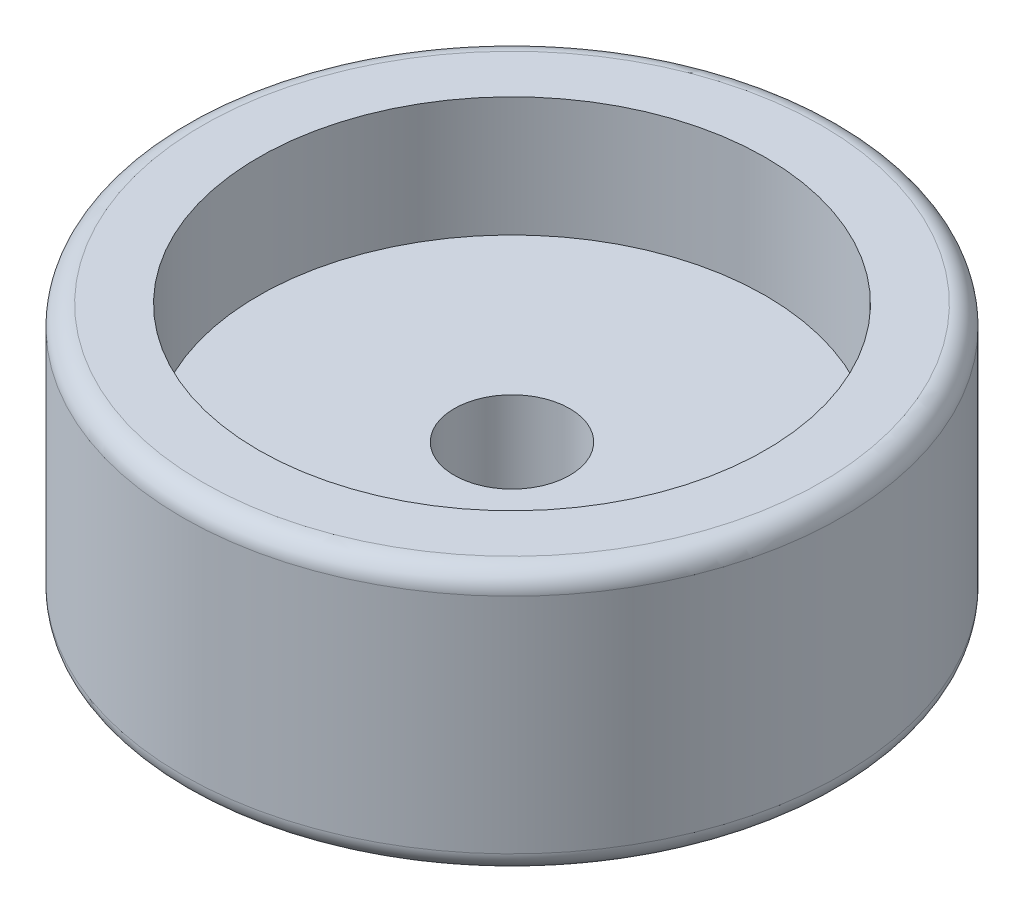
ISO-10303-21;
HEADER;
FILE_DESCRIPTION(('STEP AP214'),'2;1');
FILE_NAME('part.step','',(''),(''),'','','');
FILE_SCHEMA(('AUTOMOTIVE_DESIGN { 1 0 10303 214 1 1 1 1 }'));
ENDSEC;
DATA;
#1=APPLICATION_CONTEXT('core data for automotive mechanical design processes');
#2=APPLICATION_PROTOCOL_DEFINITION('international standard','automotive_design',2000,#1);
#3=PRODUCT_CONTEXT('',#1,'mechanical');
#4=PRODUCT('Part','Part','',(#3));
#5=PRODUCT_RELATED_PRODUCT_CATEGORY('part','',(#4));
#6=PRODUCT_DEFINITION_FORMATION('','',#4);
#7=PRODUCT_DEFINITION_CONTEXT('part definition',#1,'design');
#8=PRODUCT_DEFINITION('design','',#6,#7);
#9=PRODUCT_DEFINITION_SHAPE('','',#8);
#10=(LENGTH_UNIT() NAMED_UNIT(*) SI_UNIT(.MILLI.,.METRE.));
#11=(NAMED_UNIT(*) PLANE_ANGLE_UNIT() SI_UNIT($,.RADIAN.));
#12=(NAMED_UNIT(*) SI_UNIT($,.STERADIAN.) SOLID_ANGLE_UNIT());
#13=UNCERTAINTY_MEASURE_WITH_UNIT(LENGTH_MEASURE(1.E-05),#10,'distance_accuracy_value','');
#14=(GEOMETRIC_REPRESENTATION_CONTEXT(3) GLOBAL_UNCERTAINTY_ASSIGNED_CONTEXT((#13)) GLOBAL_UNIT_ASSIGNED_CONTEXT((#10,
#11,#12)) REPRESENTATION_CONTEXT('',''));
#15=CARTESIAN_POINT('',(0.,0.,0.));
#16=DIRECTION('',(0.,0.,1.));
#17=DIRECTION('',(1.,0.,0.));
#18=AXIS2_PLACEMENT_3D('',#15,#16,#17);
#19=CARTESIAN_POINT('',(0.,26.,0.));
#20=DIRECTION('',(0.,-1.,0.));
#21=DIRECTION('',(0.,0.,-1.));
#22=AXIS2_PLACEMENT_3D('',#19,#20,#21);
#23=CYLINDRICAL_SURFACE('',#22,5.7);
#24=CARTESIAN_POINT('',(0.,0.,0.));
#25=DIRECTION('',(0.,1.,0.));
#26=DIRECTION('',(0.,0.,1.));
#27=AXIS2_PLACEMENT_3D('',#24,#25,#26);
#28=CIRCLE('',#27,5.7);
#29=CARTESIAN_POINT('',(0.,0.,-5.7));
#30=VERTEX_POINT('',#29);
#31=EDGE_CURVE('E64',#30,#30,#28,.T.);
#32=CARTESIAN_POINT('',(0.,14.2,0.));
#33=DIRECTION('',(0.,1.,0.));
#34=DIRECTION('',(0.,0.,1.));
#35=AXIS2_PLACEMENT_3D('',#32,#33,#34);
#36=CIRCLE('',#35,5.7);
#37=CARTESIAN_POINT('',(0.,14.2,-5.7));
#38=VERTEX_POINT('',#37);
#39=EDGE_CURVE('E65',#38,#38,#36,.T.);
#40=CARTESIAN_POINT('',(0.,0.,-5.7));
#41=CARTESIAN_POINT('',(0.,0.147916666666667,-5.7));
#42=CARTESIAN_POINT('',(0.,0.295833333333333,-5.7));
#43=CARTESIAN_POINT('',(0.,0.591666666666666,-5.7));
#44=CARTESIAN_POINT('',(0.,0.739583333333333,-5.7));
#45=CARTESIAN_POINT('',(0.,1.03541666666667,-5.7));
#46=CARTESIAN_POINT('',(0.,1.18333333333333,-5.7));
#47=CARTESIAN_POINT('',(0.,1.47916666666667,-5.7));
#48=CARTESIAN_POINT('',(0.,1.62708333333333,-5.7));
#49=CARTESIAN_POINT('',(0.,1.92291666666667,-5.7));
#50=CARTESIAN_POINT('',(0.,2.07083333333333,-5.7));
#51=CARTESIAN_POINT('',(0.,2.36666666666666,-5.7));
#52=CARTESIAN_POINT('',(0.,2.51458333333333,-5.7));
#53=CARTESIAN_POINT('',(0.,2.81041666666666,-5.7));
#54=CARTESIAN_POINT('',(0.,2.95833333333333,-5.7));
#55=CARTESIAN_POINT('',(0.,3.25416666666666,-5.7));
#56=CARTESIAN_POINT('',(0.,3.40208333333333,-5.7));
#57=CARTESIAN_POINT('',(0.,3.69791666666666,-5.7));
#58=CARTESIAN_POINT('',(0.,3.84583333333333,-5.7));
#59=CARTESIAN_POINT('',(0.,4.14166666666666,-5.7));
#60=CARTESIAN_POINT('',(0.,4.28958333333333,-5.7));
#61=CARTESIAN_POINT('',(0.,4.58541666666666,-5.7));
#62=CARTESIAN_POINT('',(0.,4.73333333333333,-5.7));
#63=CARTESIAN_POINT('',(0.,5.02916666666667,-5.7));
#64=CARTESIAN_POINT('',(0.,5.17708333333333,-5.7));
#65=CARTESIAN_POINT('',(0.,5.47291666666667,-5.7));
#66=CARTESIAN_POINT('',(0.,5.62083333333333,-5.7));
#67=CARTESIAN_POINT('',(0.,5.91666666666667,-5.7));
#68=CARTESIAN_POINT('',(0.,6.06458333333333,-5.7));
#69=CARTESIAN_POINT('',(0.,6.36041666666667,-5.7));
#70=CARTESIAN_POINT('',(0.,6.50833333333333,-5.7));
#71=CARTESIAN_POINT('',(0.,6.80416666666667,-5.7));
#72=CARTESIAN_POINT('',(0.,6.95208333333333,-5.7));
#73=CARTESIAN_POINT('',(0.,7.24791666666667,-5.7));
#74=CARTESIAN_POINT('',(0.,7.39583333333333,-5.7));
#75=CARTESIAN_POINT('',(0.,7.69166666666667,-5.7));
#76=CARTESIAN_POINT('',(0.,7.83958333333333,-5.7));
#77=CARTESIAN_POINT('',(0.,8.13541666666666,-5.7));
#78=CARTESIAN_POINT('',(0.,8.28333333333333,-5.7));
#79=CARTESIAN_POINT('',(0.,8.57916666666666,-5.7));
#80=CARTESIAN_POINT('',(0.,8.72708333333333,-5.7));
#81=CARTESIAN_POINT('',(0.,9.02291666666667,-5.7));
#82=CARTESIAN_POINT('',(0.,9.17083333333333,-5.7));
#83=CARTESIAN_POINT('',(0.,9.46666666666667,-5.7));
#84=CARTESIAN_POINT('',(0.,9.61458333333333,-5.7));
#85=CARTESIAN_POINT('',(0.,9.91041666666667,-5.7));
#86=CARTESIAN_POINT('',(0.,10.0583333333333,-5.7));
#87=CARTESIAN_POINT('',(0.,10.3541666666667,-5.7));
#88=CARTESIAN_POINT('',(0.,10.5020833333333,-5.7));
#89=CARTESIAN_POINT('',(0.,10.7979166666667,-5.7));
#90=CARTESIAN_POINT('',(0.,10.9458333333333,-5.7));
#91=CARTESIAN_POINT('',(0.,11.2416666666667,-5.7));
#92=CARTESIAN_POINT('',(0.,11.3895833333333,-5.7));
#93=CARTESIAN_POINT('',(0.,11.6854166666667,-5.7));
#94=CARTESIAN_POINT('',(0.,11.8333333333333,-5.7));
#95=CARTESIAN_POINT('',(0.,12.1291666666667,-5.7));
#96=CARTESIAN_POINT('',(0.,12.2770833333333,-5.7));
#97=CARTESIAN_POINT('',(0.,12.5729166666667,-5.7));
#98=CARTESIAN_POINT('',(0.,12.7208333333333,-5.7));
#99=CARTESIAN_POINT('',(0.,13.0166666666667,-5.7));
#100=CARTESIAN_POINT('',(0.,13.1645833333333,-5.7));
#101=CARTESIAN_POINT('',(0.,13.4604166666667,-5.7));
#102=CARTESIAN_POINT('',(0.,13.6083333333333,-5.7));
#103=CARTESIAN_POINT('',(0.,13.9041666666667,-5.7));
#104=CARTESIAN_POINT('',(0.,14.0520833333333,-5.7));
#105=CARTESIAN_POINT('',(0.,14.2,-5.7));
#106=B_SPLINE_CURVE_WITH_KNOTS('',3,(#40,#41,#42,#43,#44,#45,#46,#47,#48,#49,#50,#51,#52,#53,
#54,#55,#56,#57,#58,#59,#60,#61,#62,#63,#64,#65,#66,#67,#68,#69,#70,#71,#72,#73,#74,#75,#76,#77,
#78,#79,#80,#81,#82,#83,#84,#85,#86,#87,#88,#89,#90,#91,#92,#93,#94,#95,#96,#97,#98,#99,#100,
#101,#102,#103,#104,#105),.UNSPECIFIED.,.F.,.F.,(4,2,2,2,2,2,2,2,2,2,2,2,2,2,2,2,2,2,2,2,2,2,2,
2,2,2,2,2,2,2,2,2,4),(0.,0.44375,0.887499999999999,1.33125,1.775,2.21875,2.6625,3.10625,3.55,
3.99375,4.4375,4.88125,5.325,5.76875,6.2125,6.65625,7.1,7.54375,7.9875,8.43125,8.875,9.31875,
9.7625,10.20625,10.65,11.09375,11.5375,11.98125,12.425,12.86875,13.3125,13.75625,14.2),.UNSPECIFIED.);
#107=EDGE_CURVE('BSEAM40',#30,#38,#106,.T.);
#108=ORIENTED_EDGE('',*,*,#31,.F.);
#109=ORIENTED_EDGE('',*,*,#39,.T.);
#110=ORIENTED_EDGE('',*,*,#107,.T.);
#111=ORIENTED_EDGE('',*,*,#107,.F.);
#112=EDGE_LOOP('',(#108,#110,#109,#111));
#113=FACE_BOUND('',#112,.T.);
#114=ADVANCED_FACE('F40',(#113),#23,.F.);
#115=CARTESIAN_POINT('',(0.,26.,0.));
#116=DIRECTION('',(0.,1.,0.));
#117=DIRECTION('',(0.,0.,1.));
#118=AXIS2_PLACEMENT_3D('',#115,#116,#117);
#119=PLANE('',#118);
#120=CARTESIAN_POINT('',(0.,26.,0.));
#121=DIRECTION('',(0.,1.,0.));
#122=DIRECTION('',(0.,0.,1.));
#123=AXIS2_PLACEMENT_3D('',#120,#121,#122);
#124=CIRCLE('',#123,30.5);
#125=CARTESIAN_POINT('',(0.,26.,30.5));
#126=VERTEX_POINT('',#125);
#127=EDGE_CURVE('E58',#126,#126,#124,.T.);
#128=ORIENTED_EDGE('',*,*,#127,.T.);
#129=EDGE_LOOP('',(#128));
#130=FACE_BOUND('',#129,.T.);
#131=CARTESIAN_POINT('',(0.,26.,0.));
#132=DIRECTION('',(0.,1.,0.));
#133=DIRECTION('',(0.,0.,1.));
#134=AXIS2_PLACEMENT_3D('',#131,#132,#133);
#135=CIRCLE('',#134,25.);
#136=CARTESIAN_POINT('',(0.,26.,25.));
#137=VERTEX_POINT('',#136);
#138=EDGE_CURVE('E73',#137,#137,#135,.T.);
#139=ORIENTED_EDGE('',*,*,#138,.F.);
#140=EDGE_LOOP('',(#139));
#141=FACE_BOUND('',#140,.T.);
#142=ADVANCED_FACE('F90',(#130,#141),#119,.T.);
#143=CARTESIAN_POINT('',(0.,0.,0.));
#144=DIRECTION('',(0.,1.,0.));
#145=DIRECTION('',(0.,0.,1.));
#146=AXIS2_PLACEMENT_3D('',#143,#144,#145);
#147=PLANE('',#146);
#148=CARTESIAN_POINT('',(0.,0.,0.));
#149=DIRECTION('',(0.,1.,0.));
#150=DIRECTION('',(0.,0.,1.));
#151=AXIS2_PLACEMENT_3D('',#148,#149,#150);
#152=CIRCLE('',#151,30.5);
#153=CARTESIAN_POINT('',(0.,0.,30.5));
#154=VERTEX_POINT('',#153);
#155=EDGE_CURVE('E10',#154,#154,#152,.F.);
#156=ORIENTED_EDGE('',*,*,#155,.T.);
#157=EDGE_LOOP('',(#156));
#158=FACE_BOUND('',#157,.T.);
#159=ORIENTED_EDGE('',*,*,#31,.T.);
#160=EDGE_LOOP('',(#159));
#161=FACE_BOUND('',#160,.T.);
#162=ADVANCED_FACE('F92',(#158,#161),#147,.F.);
#163=CARTESIAN_POINT('',(0.,26.,0.));
#164=DIRECTION('',(0.,-1.,0.));
#165=DIRECTION('',(0.,0.,-1.));
#166=AXIS2_PLACEMENT_3D('',#163,#164,#165);
#167=CYLINDRICAL_SURFACE('',#166,32.5);
#168=CARTESIAN_POINT('',(0.,24.,0.));
#169=DIRECTION('',(0.,1.,0.));
#170=DIRECTION('',(0.,0.,1.));
#171=AXIS2_PLACEMENT_3D('',#168,#169,#170);
#172=CIRCLE('',#171,32.5);
#173=CARTESIAN_POINT('',(0.,24.,-32.5));
#174=VERTEX_POINT('',#173);
#175=EDGE_CURVE('E48',#174,#174,#172,.F.);
#176=CARTESIAN_POINT('',(0.,2.,0.));
#177=DIRECTION('',(0.,1.,0.));
#178=DIRECTION('',(0.,0.,1.));
#179=AXIS2_PLACEMENT_3D('',#176,#177,#178);
#180=CIRCLE('',#179,32.5);
#181=CARTESIAN_POINT('',(0.,1.99999999999999,-32.5));
#182=VERTEX_POINT('',#181);
#183=EDGE_CURVE('E53',#182,#182,#180,.T.);
#184=CARTESIAN_POINT('',(0.,24.,-32.5));
#185=CARTESIAN_POINT('',(0.,23.7708333333333,-32.5));
#186=CARTESIAN_POINT('',(0.,23.5416666666667,-32.5));
#187=CARTESIAN_POINT('',(0.,23.0833333333333,-32.5));
#188=CARTESIAN_POINT('',(0.,22.8541666666667,-32.5));
#189=CARTESIAN_POINT('',(0.,22.3958333333333,-32.5));
#190=CARTESIAN_POINT('',(0.,22.1666666666667,-32.5));
#191=CARTESIAN_POINT('',(0.,21.7083333333333,-32.5));
#192=CARTESIAN_POINT('',(0.,21.4791666666667,-32.5));
#193=CARTESIAN_POINT('',(0.,21.0208333333333,-32.5));
#194=CARTESIAN_POINT('',(0.,20.7916666666667,-32.5));
#195=CARTESIAN_POINT('',(0.,20.3333333333333,-32.5));
#196=CARTESIAN_POINT('',(0.,20.1041666666667,-32.5));
#197=CARTESIAN_POINT('',(0.,19.6458333333333,-32.5));
#198=CARTESIAN_POINT('',(0.,19.4166666666667,-32.5));
#199=CARTESIAN_POINT('',(0.,18.9583333333333,-32.5));
#200=CARTESIAN_POINT('',(0.,18.7291666666667,-32.5));
#201=CARTESIAN_POINT('',(0.,18.2708333333333,-32.5));
#202=CARTESIAN_POINT('',(0.,18.0416666666667,-32.5));
#203=CARTESIAN_POINT('',(0.,17.5833333333333,-32.5));
#204=CARTESIAN_POINT('',(0.,17.3541666666667,-32.5));
#205=CARTESIAN_POINT('',(0.,16.8958333333333,-32.5));
#206=CARTESIAN_POINT('',(0.,16.6666666666667,-32.5));
#207=CARTESIAN_POINT('',(0.,16.2083333333333,-32.5));
#208=CARTESIAN_POINT('',(0.,15.9791666666667,-32.5));
#209=CARTESIAN_POINT('',(0.,15.5208333333333,-32.5));
#210=CARTESIAN_POINT('',(0.,15.2916666666667,-32.5));
#211=CARTESIAN_POINT('',(0.,14.8333333333333,-32.5));
#212=CARTESIAN_POINT('',(0.,14.6041666666667,-32.5));
#213=CARTESIAN_POINT('',(0.,14.1458333333333,-32.5));
#214=CARTESIAN_POINT('',(0.,13.9166666666667,-32.5));
#215=CARTESIAN_POINT('',(0.,13.4583333333333,-32.5));
#216=CARTESIAN_POINT('',(0.,13.2291666666667,-32.5));
#217=CARTESIAN_POINT('',(0.,12.7708333333333,-32.5));
#218=CARTESIAN_POINT('',(0.,12.5416666666667,-32.5));
#219=CARTESIAN_POINT('',(0.,12.0833333333333,-32.5));
#220=CARTESIAN_POINT('',(0.,11.8541666666667,-32.5));
#221=CARTESIAN_POINT('',(0.,11.3958333333333,-32.5));
#222=CARTESIAN_POINT('',(0.,11.1666666666667,-32.5));
#223=CARTESIAN_POINT('',(0.,10.7083333333333,-32.5));
#224=CARTESIAN_POINT('',(0.,10.4791666666667,-32.5));
#225=CARTESIAN_POINT('',(0.,10.0208333333333,-32.5));
#226=CARTESIAN_POINT('',(0.,9.79166666666667,-32.5));
#227=CARTESIAN_POINT('',(0.,9.33333333333333,-32.5));
#228=CARTESIAN_POINT('',(0.,9.10416666666666,-32.5));
#229=CARTESIAN_POINT('',(0.,8.64583333333333,-32.5));
#230=CARTESIAN_POINT('',(0.,8.41666666666666,-32.5));
#231=CARTESIAN_POINT('',(0.,7.95833333333333,-32.5));
#232=CARTESIAN_POINT('',(0.,7.72916666666666,-32.5));
#233=CARTESIAN_POINT('',(0.,7.27083333333333,-32.5));
#234=CARTESIAN_POINT('',(0.,7.04166666666666,-32.5));
#235=CARTESIAN_POINT('',(0.,6.58333333333333,-32.5));
#236=CARTESIAN_POINT('',(0.,6.35416666666666,-32.5));
#237=CARTESIAN_POINT('',(0.,5.89583333333333,-32.5));
#238=CARTESIAN_POINT('',(0.,5.66666666666666,-32.5));
#239=CARTESIAN_POINT('',(0.,5.20833333333333,-32.5));
#240=CARTESIAN_POINT('',(0.,4.97916666666666,-32.5));
#241=CARTESIAN_POINT('',(0.,4.52083333333333,-32.5));
#242=CARTESIAN_POINT('',(0.,4.29166666666666,-32.5));
#243=CARTESIAN_POINT('',(0.,3.83333333333333,-32.5));
#244=CARTESIAN_POINT('',(0.,3.60416666666666,-32.5));
#245=CARTESIAN_POINT('',(0.,3.14583333333333,-32.5));
#246=CARTESIAN_POINT('',(0.,2.91666666666666,-32.5));
#247=CARTESIAN_POINT('',(0.,2.45833333333333,-32.5));
#248=CARTESIAN_POINT('',(0.,2.22916666666666,-32.5));
#249=CARTESIAN_POINT('',(0.,1.99999999999999,-32.5));
#250=B_SPLINE_CURVE_WITH_KNOTS('',3,(#184,#185,#186,#187,#188,#189,#190,#191,#192,#193,#194,
#195,#196,#197,#198,#199,#200,#201,#202,#203,#204,#205,#206,#207,#208,#209,#210,#211,#212,#213,
#214,#215,#216,#217,#218,#219,#220,#221,#222,#223,#224,#225,#226,#227,#228,#229,#230,#231,#232,
#233,#234,#235,#236,#237,#238,#239,#240,#241,#242,#243,#244,#245,#246,#247,#248,#249),
.UNSPECIFIED.,.F.,.F.,(4,2,2,2,2,2,2,2,2,2,2,2,2,2,2,2,2,2,2,2,2,2,2,2,2,2,2,2,2,2,2,2,4),(0.,
0.687499999999997,1.375,2.0625,2.75,3.4375,4.125,4.8125,5.5,6.1875,6.875,7.5625,8.25,8.9375,
9.625,10.3125,11.,11.6875,12.375,13.0625,13.75,14.4375,15.125,15.8125,16.5,17.1875,17.875,
18.5625,19.25,19.9375,20.625,21.3125,22.),.UNSPECIFIED.);
#251=EDGE_CURVE('BSEAM86',#174,#182,#250,.T.);
#252=ORIENTED_EDGE('',*,*,#175,.T.);
#253=ORIENTED_EDGE('',*,*,#183,.T.);
#254=ORIENTED_EDGE('',*,*,#251,.T.);
#255=ORIENTED_EDGE('',*,*,#251,.F.);
#256=EDGE_LOOP('',(#252,#254,#253,#255));
#257=FACE_BOUND('',#256,.T.);
#258=ADVANCED_FACE('F86',(#257),#167,.T.);
#259=CARTESIAN_POINT('',(0.,14.2,0.));
#260=DIRECTION('',(0.,1.,0.));
#261=DIRECTION('',(0.,0.,1.));
#262=AXIS2_PLACEMENT_3D('',#259,#260,#261);
#263=CYLINDRICAL_SURFACE('',#262,25.);
#264=CARTESIAN_POINT('',(0.,14.2,0.));
#265=DIRECTION('',(0.,1.,0.));
#266=DIRECTION('',(0.,0.,1.));
#267=AXIS2_PLACEMENT_3D('',#264,#265,#266);
#268=CIRCLE('',#267,25.);
#269=CARTESIAN_POINT('',(0.,14.2,25.));
#270=VERTEX_POINT('',#269);
#271=EDGE_CURVE('E69',#270,#270,#268,.T.);
#272=ORIENTED_EDGE('',*,*,#271,.F.);
#273=EDGE_LOOP('',(#272));
#274=FACE_BOUND('',#273,.T.);
#275=ORIENTED_EDGE('',*,*,#138,.T.);
#276=EDGE_LOOP('',(#275));
#277=FACE_BOUND('',#276,.T.);
#278=ADVANCED_FACE('F83',(#274,#277),#263,.F.);
#279=CARTESIAN_POINT('',(0.,14.2,0.));
#280=DIRECTION('',(0.,1.,0.));
#281=DIRECTION('',(0.,0.,1.));
#282=AXIS2_PLACEMENT_3D('',#279,#280,#281);
#283=PLANE('',#282);
#284=ORIENTED_EDGE('',*,*,#39,.F.);
#285=EDGE_LOOP('',(#284));
#286=FACE_BOUND('',#285,.T.);
#287=ORIENTED_EDGE('',*,*,#271,.T.);
#288=EDGE_LOOP('',(#287));
#289=FACE_BOUND('',#288,.T.);
#290=ADVANCED_FACE('F81',(#286,#289),#283,.T.);
#291=CARTESIAN_POINT('',(0.,24.,0.));
#292=DIRECTION('',(0.,1.,0.));
#293=DIRECTION('',(0.,0.,1.));
#294=AXIS2_PLACEMENT_3D('',#291,#292,#293);
#295=TOROIDAL_SURFACE('',#294,30.5,2.);
#296=ORIENTED_EDGE('',*,*,#175,.F.);
#297=EDGE_LOOP('',(#296));
#298=FACE_BOUND('',#297,.T.);
#299=ORIENTED_EDGE('',*,*,#127,.F.);
#300=EDGE_LOOP('',(#299));
#301=FACE_BOUND('',#300,.T.);
#302=ADVANCED_FACE('F104',(#298,#301),#295,.T.);
#303=CARTESIAN_POINT('',(0.,2.,0.));
#304=DIRECTION('',(0.,1.,0.));
#305=DIRECTION('',(0.,0.,1.));
#306=AXIS2_PLACEMENT_3D('',#303,#304,#305);
#307=TOROIDAL_SURFACE('',#306,30.5,2.);
#308=ORIENTED_EDGE('',*,*,#155,.F.);
#309=EDGE_LOOP('',(#308));
#310=FACE_BOUND('',#309,.T.);
#311=ORIENTED_EDGE('',*,*,#183,.F.);
#312=EDGE_LOOP('',(#311));
#313=FACE_BOUND('',#312,.T.);
#314=ADVANCED_FACE('F42',(#310,#313),#307,.T.);
#315=CLOSED_SHELL('',(#114,#142,#162,#258,#278,#290,#302,#314));
#316=MANIFOLD_SOLID_BREP('B2',#315);
#317=ADVANCED_BREP_SHAPE_REPRESENTATION('',(#18,#316),#14);
#318=SHAPE_DEFINITION_REPRESENTATION(#9,#317);
ENDSEC;
END-ISO-10303-21;
